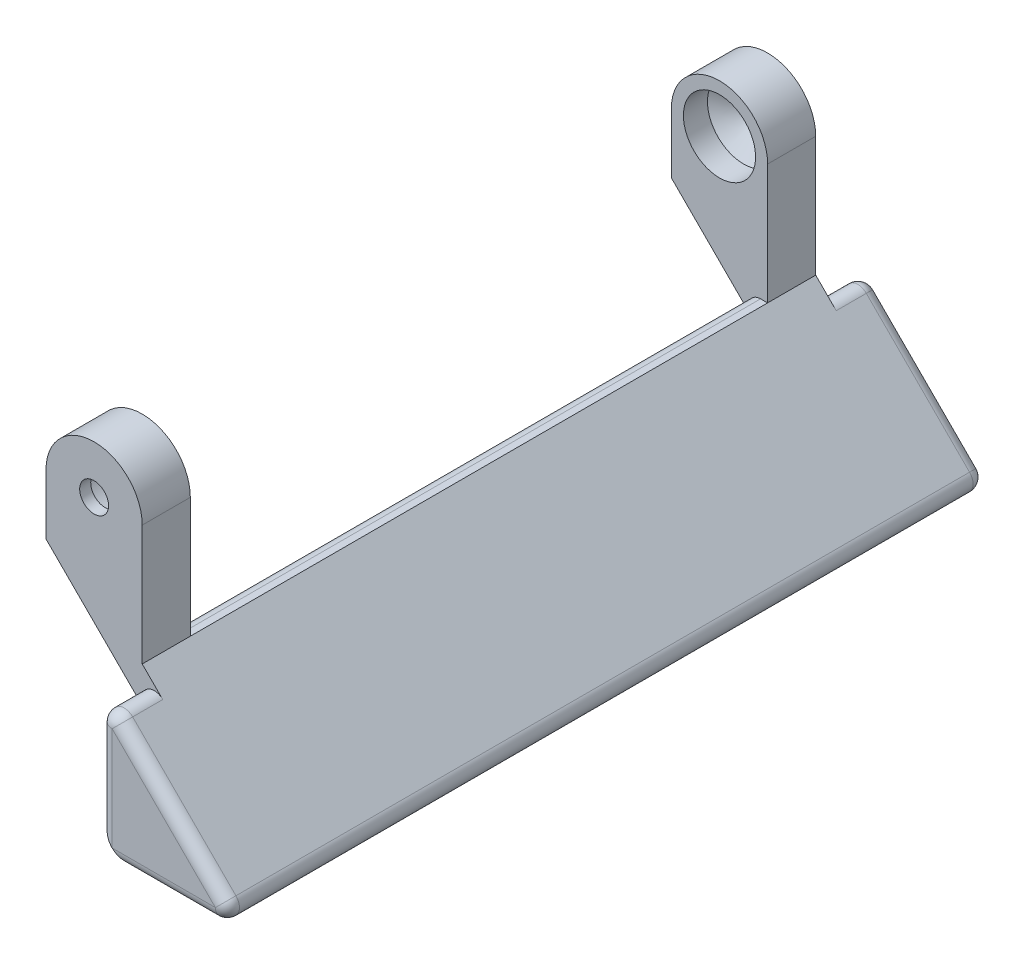
ISO-10303-21;
HEADER;
FILE_DESCRIPTION(('STEP AP214'),'2;1');
FILE_NAME('part.step','',(''),(''),'','','');
FILE_SCHEMA(('AUTOMOTIVE_DESIGN { 1 0 10303 214 1 1 1 1 }'));
ENDSEC;
DATA;
#1=APPLICATION_CONTEXT('core data for automotive mechanical design processes');
#2=APPLICATION_PROTOCOL_DEFINITION('international standard','automotive_design',2000,#1);
#3=PRODUCT_CONTEXT('',#1,'mechanical');
#4=PRODUCT('Part','Part','',(#3));
#5=PRODUCT_RELATED_PRODUCT_CATEGORY('part','',(#4));
#6=PRODUCT_DEFINITION_FORMATION('','',#4);
#7=PRODUCT_DEFINITION_CONTEXT('part definition',#1,'design');
#8=PRODUCT_DEFINITION('design','',#6,#7);
#9=PRODUCT_DEFINITION_SHAPE('','',#8);
#10=(LENGTH_UNIT() NAMED_UNIT(*) SI_UNIT(.MILLI.,.METRE.));
#11=(NAMED_UNIT(*) PLANE_ANGLE_UNIT() SI_UNIT($,.RADIAN.));
#12=(NAMED_UNIT(*) SI_UNIT($,.STERADIAN.) SOLID_ANGLE_UNIT());
#13=UNCERTAINTY_MEASURE_WITH_UNIT(LENGTH_MEASURE(1.E-05),#10,'distance_accuracy_value','');
#14=(GEOMETRIC_REPRESENTATION_CONTEXT(3) GLOBAL_UNCERTAINTY_ASSIGNED_CONTEXT((#13)) GLOBAL_UNIT_ASSIGNED_CONTEXT((#10,
#11,#12)) REPRESENTATION_CONTEXT('',''));
#15=CARTESIAN_POINT('',(0.,0.,0.));
#16=DIRECTION('',(0.,0.,1.));
#17=DIRECTION('',(1.,0.,0.));
#18=AXIS2_PLACEMENT_3D('',#15,#16,#17);
#19=CARTESIAN_POINT('',(0.,0.,63.));
#20=DIRECTION('',(1.,0.,0.));
#21=DIRECTION('',(0.,0.,-1.));
#22=AXIS2_PLACEMENT_3D('',#19,#20,#21);
#23=PLANE('',#22);
#24=DIRECTION('',(0.,1.,0.));
#25=VECTOR('',#24,1.);
#26=CARTESIAN_POINT('',(0.,0.,3.5));
#27=LINE('',#26,#25);
#28=CARTESIAN_POINT('',(0.,17.,3.5));
#29=VERTEX_POINT('',#28);
#30=CARTESIAN_POINT('',(0.,22.,3.5));
#31=VERTEX_POINT('',#30);
#32=EDGE_CURVE('E422',#29,#31,#27,.T.);
#33=ORIENTED_EDGE('',*,*,#32,.F.);
#34=DIRECTION('',(0.,0.,1.));
#35=VECTOR('',#34,1.);
#36=CARTESIAN_POINT('',(0.,17.,0.));
#37=LINE('',#36,#35);
#38=CARTESIAN_POINT('',(0.,17.,7.5));
#39=VERTEX_POINT('',#38);
#40=EDGE_CURVE('E219',#29,#39,#37,.T.);
#41=ORIENTED_EDGE('',*,*,#40,.T.);
#42=DIRECTION('',(0.,1.,0.));
#43=VECTOR('',#42,1.);
#44=CARTESIAN_POINT('',(0.,19.9999999999999,7.5));
#45=LINE('',#44,#43);
#46=CARTESIAN_POINT('',(0.,22.,7.5));
#47=VERTEX_POINT('',#46);
#48=EDGE_CURVE('E417',#39,#47,#45,.T.);
#49=ORIENTED_EDGE('',*,*,#48,.T.);
#50=DIRECTION('',(0.,0.,-1.));
#51=VECTOR('',#50,1.);
#52=CARTESIAN_POINT('',(0.,22.,63.));
#53=LINE('',#52,#51);
#54=EDGE_CURVE('E249',#47,#31,#53,.T.);
#55=ORIENTED_EDGE('',*,*,#54,.T.);
#56=EDGE_LOOP('',(#33,#41,#49,#55));
#57=FACE_BOUND('',#56,.T.);
#58=ADVANCED_FACE('F47',(#57),#23,.F.);
#59=CARTESIAN_POINT('',(4.,22.,63.));
#60=DIRECTION('',(0.,0.,-1.));
#61=DIRECTION('',(-1.,0.,0.));
#62=AXIS2_PLACEMENT_3D('',#59,#60,#61);
#63=CYLINDRICAL_SURFACE('',#62,4.);
#64=CARTESIAN_POINT('',(4.,22.,55.5));
#65=DIRECTION('',(0.,0.,-1.));
#66=DIRECTION('',(-1.,0.,0.));
#67=AXIS2_PLACEMENT_3D('',#64,#65,#66);
#68=CIRCLE('',#67,4.);
#69=CARTESIAN_POINT('',(8.,22.,55.5));
#70=VERTEX_POINT('',#69);
#71=CARTESIAN_POINT('',(0.,22.,55.5));
#72=VERTEX_POINT('',#71);
#73=EDGE_CURVE('E229',#70,#72,#68,.F.);
#74=ORIENTED_EDGE('',*,*,#73,.T.);
#75=CARTESIAN_POINT('',(0.,22.,59.5));
#76=VERTEX_POINT('',#75);
#77=EDGE_CURVE('E246',#76,#72,#53,.T.);
#78=ORIENTED_EDGE('',*,*,#77,.F.);
#79=CARTESIAN_POINT('',(4.,22.,59.5));
#80=DIRECTION('',(0.,0.,-1.));
#81=DIRECTION('',(-1.,0.,0.));
#82=AXIS2_PLACEMENT_3D('',#79,#80,#81);
#83=CIRCLE('',#82,4.);
#84=CARTESIAN_POINT('',(8.,22.,59.5));
#85=VERTEX_POINT('',#84);
#86=EDGE_CURVE('E223',#76,#85,#83,.T.);
#87=ORIENTED_EDGE('',*,*,#86,.T.);
#88=DIRECTION('',(0.,0.,-1.));
#89=VECTOR('',#88,1.);
#90=CARTESIAN_POINT('',(8.,22.,63.));
#91=LINE('',#90,#89);
#92=EDGE_CURVE('E239',#85,#70,#91,.T.);
#93=ORIENTED_EDGE('',*,*,#92,.T.);
#94=EDGE_LOOP('',(#74,#78,#87,#93));
#95=FACE_BOUND('',#94,.T.);
#96=ADVANCED_FACE('F407',(#95),#63,.T.);
#97=CARTESIAN_POINT('',(8.,11.9999999999999,63.));
#98=DIRECTION('',(-1.,0.,0.));
#99=DIRECTION('',(0.,0.,1.));
#100=AXIS2_PLACEMENT_3D('',#97,#98,#99);
#101=PLANE('',#100);
#102=DIRECTION('',(0.,1.,0.));
#103=VECTOR('',#102,1.);
#104=CARTESIAN_POINT('',(8.,22.,55.5));
#105=LINE('',#104,#103);
#106=CARTESIAN_POINT('',(8.,11.9999999999999,55.5));
#107=VERTEX_POINT('',#106);
#108=EDGE_CURVE('E225',#107,#70,#105,.T.);
#109=ORIENTED_EDGE('',*,*,#108,.T.);
#110=ORIENTED_EDGE('',*,*,#92,.F.);
#111=DIRECTION('',(0.,1.,0.));
#112=VECTOR('',#111,1.);
#113=CARTESIAN_POINT('',(8.,0.,59.5));
#114=LINE('',#113,#112);
#115=CARTESIAN_POINT('',(8.,11.9999999999999,59.5));
#116=VERTEX_POINT('',#115);
#117=EDGE_CURVE('E224',#116,#85,#114,.T.);
#118=ORIENTED_EDGE('',*,*,#117,.F.);
#119=DIRECTION('',(0.,0.,-1.));
#120=VECTOR('',#119,1.);
#121=CARTESIAN_POINT('',(8.,11.9999999999999,63.));
#122=LINE('',#121,#120);
#123=EDGE_CURVE('E245',#116,#107,#122,.T.);
#124=ORIENTED_EDGE('',*,*,#123,.T.);
#125=EDGE_LOOP('',(#109,#110,#118,#124));
#126=FACE_BOUND('',#125,.T.);
#127=ADVANCED_FACE('F403',(#126),#101,.F.);
#128=CARTESIAN_POINT('',(4.,22.,63.));
#129=DIRECTION('',(0.,0.,1.));
#130=DIRECTION('',(1.,0.,0.));
#131=AXIS2_PLACEMENT_3D('',#128,#129,#130);
#132=PLANE('',#131);
#133=DIRECTION('',(-0.707106781186551,0.707106781186544,0.));
#134=VECTOR('',#133,1.);
#135=CARTESIAN_POINT('',(7.29289321881345,11.2928932188133,63.));
#136=LINE('',#135,#134);
#137=CARTESIAN_POINT('',(17.5857864376269,1.,63.));
#138=VERTEX_POINT('',#137);
#139=CARTESIAN_POINT('',(9.,9.58578643762679,63.));
#140=VERTEX_POINT('',#139);
#141=EDGE_CURVE('E302',#138,#140,#136,.T.);
#142=ORIENTED_EDGE('',*,*,#141,.T.);
#143=DIRECTION('',(0.,1.,0.));
#144=VECTOR('',#143,1.);
#145=CARTESIAN_POINT('',(9.,2.00000000000001,63.));
#146=LINE('',#145,#144);
#147=CARTESIAN_POINT('',(9.00000000000001,0.999999999999997,63.));
#148=VERTEX_POINT('',#147);
#149=EDGE_CURVE('E340',#140,#148,#146,.F.);
#150=ORIENTED_EDGE('',*,*,#149,.T.);
#151=DIRECTION('',(1.,0.,0.));
#152=VECTOR('',#151,1.);
#153=CARTESIAN_POINT('',(20.,1.,63.));
#154=LINE('',#153,#152);
#155=EDGE_CURVE('E300',#148,#138,#154,.T.);
#156=ORIENTED_EDGE('',*,*,#155,.T.);
#157=EDGE_LOOP('',(#142,#150,#156));
#158=FACE_BOUND('',#157,.T.);
#159=ADVANCED_FACE('F385',(#158),#132,.T.);
#160=CARTESIAN_POINT('',(4.,22.,0.));
#161=DIRECTION('',(0.,0.,1.));
#162=DIRECTION('',(1.,0.,0.));
#163=AXIS2_PLACEMENT_3D('',#160,#161,#162);
#164=PLANE('',#163);
#165=DIRECTION('',(1.,0.,0.));
#166=VECTOR('',#165,1.);
#167=CARTESIAN_POINT('',(4.,1.,0.));
#168=LINE('',#167,#166);
#169=CARTESIAN_POINT('',(17.5857864376269,1.,0.));
#170=VERTEX_POINT('',#169);
#171=CARTESIAN_POINT('',(9.00000000000001,1.,0.));
#172=VERTEX_POINT('',#171);
#173=EDGE_CURVE('E290',#170,#172,#168,.F.);
#174=ORIENTED_EDGE('',*,*,#173,.T.);
#175=DIRECTION('',(0.,-1.,0.));
#176=VECTOR('',#175,1.);
#177=CARTESIAN_POINT('',(9.,22.,0.));
#178=LINE('',#177,#176);
#179=CARTESIAN_POINT('',(9.,9.58578643762679,0.));
#180=VERTEX_POINT('',#179);
#181=EDGE_CURVE('E336',#172,#180,#178,.F.);
#182=ORIENTED_EDGE('',*,*,#181,.T.);
#183=DIRECTION('',(-0.707106781186551,0.707106781186544,0.));
#184=VECTOR('',#183,1.);
#185=CARTESIAN_POINT('',(0.292893218813368,18.2928932188133,0.));
#186=LINE('',#185,#184);
#187=EDGE_CURVE('E293',#180,#170,#186,.F.);
#188=ORIENTED_EDGE('',*,*,#187,.T.);
#189=EDGE_LOOP('',(#174,#182,#188));
#190=FACE_BOUND('',#189,.T.);
#191=ADVANCED_FACE('F444',(#190),#164,.F.);
#192=ORIENTED_EDGE('',*,*,#54,.F.);
#193=CARTESIAN_POINT('',(4.,22.,7.5));
#194=DIRECTION('',(0.,0.,-1.));
#195=DIRECTION('',(0.,1.,0.));
#196=AXIS2_PLACEMENT_3D('',#193,#194,#195);
#197=CIRCLE('',#196,4.);
#198=CARTESIAN_POINT('',(8.,22.,7.5));
#199=VERTEX_POINT('',#198);
#200=EDGE_CURVE('E410',#47,#199,#197,.T.);
#201=ORIENTED_EDGE('',*,*,#200,.T.);
#202=CARTESIAN_POINT('',(8.,22.,3.5));
#203=VERTEX_POINT('',#202);
#204=EDGE_CURVE('E238',#199,#203,#91,.T.);
#205=ORIENTED_EDGE('',*,*,#204,.T.);
#206=CARTESIAN_POINT('',(4.,22.,3.5));
#207=DIRECTION('',(0.,0.,1.));
#208=DIRECTION('',(1.,0.,0.));
#209=AXIS2_PLACEMENT_3D('',#206,#207,#208);
#210=CIRCLE('',#209,4.);
#211=EDGE_CURVE('E234',#203,#31,#210,.T.);
#212=ORIENTED_EDGE('',*,*,#211,.T.);
#213=EDGE_LOOP('',(#192,#201,#205,#212));
#214=FACE_BOUND('',#213,.T.);
#215=ADVANCED_FACE('F471',(#214),#63,.T.);
#216=DIRECTION('',(0.,-1.,0.));
#217=VECTOR('',#216,1.);
#218=CARTESIAN_POINT('',(0.,19.9999999999999,55.5));
#219=LINE('',#218,#217);
#220=CARTESIAN_POINT('',(0.,17.,55.5));
#221=VERTEX_POINT('',#220);
#222=EDGE_CURVE('E218',#72,#221,#219,.T.);
#223=ORIENTED_EDGE('',*,*,#222,.T.);
#224=CARTESIAN_POINT('',(0.,17.,59.5));
#225=VERTEX_POINT('',#224);
#226=EDGE_CURVE('E201',#221,#225,#37,.T.);
#227=ORIENTED_EDGE('',*,*,#226,.T.);
#228=DIRECTION('',(0.,-1.,0.));
#229=VECTOR('',#228,1.);
#230=CARTESIAN_POINT('',(0.,0.,59.5));
#231=LINE('',#230,#229);
#232=EDGE_CURVE('E216',#76,#225,#231,.T.);
#233=ORIENTED_EDGE('',*,*,#232,.F.);
#234=ORIENTED_EDGE('',*,*,#77,.T.);
#235=EDGE_LOOP('',(#223,#227,#233,#234));
#236=FACE_BOUND('',#235,.T.);
#237=ADVANCED_FACE('F214',(#236),#23,.F.);
#238=CARTESIAN_POINT('',(0.,0.,63.));
#239=DIRECTION('',(0.,1.,0.));
#240=DIRECTION('',(0.,0.,1.));
#241=AXIS2_PLACEMENT_3D('',#238,#239,#240);
#242=PLANE('',#241);
#243=DIRECTION('',(0.,0.,-1.));
#244=VECTOR('',#243,1.);
#245=CARTESIAN_POINT('',(10.,0.,63.));
#246=LINE('',#245,#244);
#247=CARTESIAN_POINT('',(10.,0.,62.));
#248=VERTEX_POINT('',#247);
#249=CARTESIAN_POINT('',(10.,0.,1.));
#250=VERTEX_POINT('',#249);
#251=EDGE_CURVE('E252',#248,#250,#246,.T.);
#252=ORIENTED_EDGE('',*,*,#251,.T.);
#253=DIRECTION('',(1.,0.,0.));
#254=VECTOR('',#253,1.);
#255=CARTESIAN_POINT('',(0.,0.,1.));
#256=LINE('',#255,#254);
#257=CARTESIAN_POINT('',(17.5857864376269,0.,1.));
#258=VERTEX_POINT('',#257);
#259=EDGE_CURVE('E288',#250,#258,#256,.T.);
#260=ORIENTED_EDGE('',*,*,#259,.T.);
#261=DIRECTION('',(0.,0.,-1.));
#262=VECTOR('',#261,1.);
#263=CARTESIAN_POINT('',(17.5857864376269,0.,63.));
#264=LINE('',#263,#262);
#265=CARTESIAN_POINT('',(17.5857864376269,0.,62.));
#266=VERTEX_POINT('',#265);
#267=EDGE_CURVE('E286',#258,#266,#264,.F.);
#268=ORIENTED_EDGE('',*,*,#267,.T.);
#269=DIRECTION('',(1.,0.,0.));
#270=VECTOR('',#269,1.);
#271=CARTESIAN_POINT('',(10.,0.,62.));
#272=LINE('',#271,#270);
#273=EDGE_CURVE('E284',#266,#248,#272,.F.);
#274=ORIENTED_EDGE('',*,*,#273,.T.);
#275=EDGE_LOOP('',(#252,#260,#268,#274));
#276=FACE_BOUND('',#275,.T.);
#277=ADVANCED_FACE('F453',(#276),#242,.F.);
#278=CARTESIAN_POINT('',(20.,0.,63.));
#279=DIRECTION('',(-0.707106781186544,-0.707106781186552,0.));
#280=DIRECTION('',(0.707106781186551,-0.707106781186544,0.));
#281=AXIS2_PLACEMENT_3D('',#278,#279,#280);
#282=PLANE('',#281);
#283=DIRECTION('',(-0.707106781186551,0.707106781186544,0.));
#284=VECTOR('',#283,1.);
#285=CARTESIAN_POINT('',(20.,0.,1.));
#286=LINE('',#285,#284);
#287=CARTESIAN_POINT('',(18.2928932188134,1.70710678118655,1.));
#288=VERTEX_POINT('',#287);
#289=CARTESIAN_POINT('',(9.70710678118655,10.2928932188133,1.));
#290=VERTEX_POINT('',#289);
#291=EDGE_CURVE('E281',#288,#290,#286,.T.);
#292=ORIENTED_EDGE('',*,*,#291,.T.);
#293=DIRECTION('',(0.,0.,-1.));
#294=VECTOR('',#293,1.);
#295=CARTESIAN_POINT('',(9.70710678118655,10.2928932188133,63.));
#296=LINE('',#295,#294);
#297=CARTESIAN_POINT('',(9.70710678118655,10.2928932188133,3.5));
#298=VERTEX_POINT('',#297);
#299=EDGE_CURVE('E348',#290,#298,#296,.F.);
#300=ORIENTED_EDGE('',*,*,#299,.T.);
#301=DIRECTION('',(-0.707106781186551,0.707106781186544,0.));
#302=VECTOR('',#301,1.);
#303=CARTESIAN_POINT('',(20.,0.,3.5));
#304=LINE('',#303,#302);
#305=CARTESIAN_POINT('',(8.,11.9999999999999,3.5));
#306=VERTEX_POINT('',#305);
#307=EDGE_CURVE('E71',#298,#306,#304,.T.);
#308=ORIENTED_EDGE('',*,*,#307,.T.);
#309=CARTESIAN_POINT('',(8.,12.,7.49999999999999));
#310=VERTEX_POINT('',#309);
#311=EDGE_CURVE('E242',#310,#306,#122,.T.);
#312=ORIENTED_EDGE('',*,*,#311,.F.);
#313=DIRECTION('',(0.,0.,1.));
#314=VECTOR('',#313,1.);
#315=CARTESIAN_POINT('',(7.99999999999987,12.,63.));
#316=LINE('',#315,#314);
#317=EDGE_CURVE('E399',#310,#107,#316,.T.);
#318=ORIENTED_EDGE('',*,*,#317,.T.);
#319=ORIENTED_EDGE('',*,*,#123,.F.);
#320=DIRECTION('',(0.707106781186551,-0.707106781186544,0.));
#321=VECTOR('',#320,1.);
#322=CARTESIAN_POINT('',(20.,0.,59.5));
#323=LINE('',#322,#321);
#324=CARTESIAN_POINT('',(9.70710678118655,10.2928932188133,59.5));
#325=VERTEX_POINT('',#324);
#326=EDGE_CURVE('E63',#116,#325,#323,.T.);
#327=ORIENTED_EDGE('',*,*,#326,.T.);
#328=DIRECTION('',(0.,0.,-1.));
#329=VECTOR('',#328,1.);
#330=CARTESIAN_POINT('',(9.70710678118655,10.2928932188133,63.));
#331=LINE('',#330,#329);
#332=CARTESIAN_POINT('',(9.70710678118655,10.2928932188133,62.));
#333=VERTEX_POINT('',#332);
#334=EDGE_CURVE('E344',#325,#333,#331,.F.);
#335=ORIENTED_EDGE('',*,*,#334,.T.);
#336=DIRECTION('',(-0.707106781186551,0.707106781186544,0.));
#337=VECTOR('',#336,1.);
#338=CARTESIAN_POINT('',(20.,0.,62.));
#339=LINE('',#338,#337);
#340=CARTESIAN_POINT('',(18.2928932188134,1.70710678118655,62.));
#341=VERTEX_POINT('',#340);
#342=EDGE_CURVE('E276',#333,#341,#339,.F.);
#343=ORIENTED_EDGE('',*,*,#342,.T.);
#344=DIRECTION('',(0.,0.,-1.));
#345=VECTOR('',#344,1.);
#346=CARTESIAN_POINT('',(18.2928932188134,1.70710678118655,63.));
#347=LINE('',#346,#345);
#348=EDGE_CURVE('E278',#341,#288,#347,.T.);
#349=ORIENTED_EDGE('',*,*,#348,.T.);
#350=EDGE_LOOP('',(#292,#300,#308,#312,#318,#319,#327,#335,#343,#349));
#351=FACE_BOUND('',#350,.T.);
#352=ADVANCED_FACE('F392',(#351),#282,.F.);
#353=ORIENTED_EDGE('',*,*,#204,.F.);
#354=DIRECTION('',(0.,-1.,0.));
#355=VECTOR('',#354,1.);
#356=CARTESIAN_POINT('',(8.,22.,7.5));
#357=LINE('',#356,#355);
#358=EDGE_CURVE('E414',#199,#310,#357,.T.);
#359=ORIENTED_EDGE('',*,*,#358,.T.);
#360=ORIENTED_EDGE('',*,*,#311,.T.);
#361=DIRECTION('',(0.,-1.,0.));
#362=VECTOR('',#361,1.);
#363=CARTESIAN_POINT('',(8.,0.,3.5));
#364=LINE('',#363,#362);
#365=EDGE_CURVE('E235',#203,#306,#364,.T.);
#366=ORIENTED_EDGE('',*,*,#365,.F.);
#367=EDGE_LOOP('',(#353,#359,#360,#366));
#368=FACE_BOUND('',#367,.T.);
#369=ADVANCED_FACE('F467',(#368),#101,.F.);
#370=CARTESIAN_POINT('',(8.,0.,0.));
#371=DIRECTION('',(1.,0.,0.));
#372=DIRECTION('',(0.,0.,-1.));
#373=AXIS2_PLACEMENT_3D('',#370,#371,#372);
#374=PLANE('',#373);
#375=DIRECTION('',(0.,0.,-1.));
#376=VECTOR('',#375,1.);
#377=CARTESIAN_POINT('',(8.,9.58578643762679,0.));
#378=LINE('',#377,#376);
#379=CARTESIAN_POINT('',(8.,9.58578643762679,3.5));
#380=VERTEX_POINT('',#379);
#381=CARTESIAN_POINT('',(8.,9.58578643762679,1.));
#382=VERTEX_POINT('',#381);
#383=EDGE_CURVE('E327',#380,#382,#378,.T.);
#384=ORIENTED_EDGE('',*,*,#383,.T.);
#385=DIRECTION('',(0.,-1.,0.));
#386=VECTOR('',#385,1.);
#387=CARTESIAN_POINT('',(8.,0.,1.));
#388=LINE('',#387,#386);
#389=CARTESIAN_POINT('',(8.,2.00000000000001,1.));
#390=VERTEX_POINT('',#389);
#391=EDGE_CURVE('E329',#382,#390,#388,.T.);
#392=ORIENTED_EDGE('',*,*,#391,.T.);
#393=DIRECTION('',(0.,0.,1.));
#394=VECTOR('',#393,1.);
#395=CARTESIAN_POINT('',(8.,2.00000000000001,0.));
#396=LINE('',#395,#394);
#397=CARTESIAN_POINT('',(8.,2.00000000000001,62.));
#398=VERTEX_POINT('',#397);
#399=EDGE_CURVE('E248',#390,#398,#396,.T.);
#400=ORIENTED_EDGE('',*,*,#399,.T.);
#401=DIRECTION('',(0.,1.,0.));
#402=VECTOR('',#401,1.);
#403=CARTESIAN_POINT('',(8.,10.5857864376268,62.));
#404=LINE('',#403,#402);
#405=CARTESIAN_POINT('',(8.,9.58578643762679,62.));
#406=VERTEX_POINT('',#405);
#407=EDGE_CURVE('E324',#398,#406,#404,.T.);
#408=ORIENTED_EDGE('',*,*,#407,.T.);
#409=DIRECTION('',(0.,0.,-1.));
#410=VECTOR('',#409,1.);
#411=CARTESIAN_POINT('',(8.,9.58578643762679,0.));
#412=LINE('',#411,#410);
#413=CARTESIAN_POINT('',(8.,9.58578643762679,59.5));
#414=VERTEX_POINT('',#413);
#415=EDGE_CURVE('E305',#406,#414,#412,.T.);
#416=ORIENTED_EDGE('',*,*,#415,.T.);
#417=CARTESIAN_POINT('',(8.,8.99999999999998,59.5));
#418=VERTEX_POINT('',#417);
#419=EDGE_CURVE('E227',#418,#414,#114,.T.);
#420=ORIENTED_EDGE('',*,*,#419,.F.);
#421=DIRECTION('',(0.,0.,-1.));
#422=VECTOR('',#421,1.);
#423=CARTESIAN_POINT('',(8.,8.99999999999998,3.5));
#424=LINE('',#423,#422);
#425=CARTESIAN_POINT('',(8.,8.99999999999998,3.5));
#426=VERTEX_POINT('',#425);
#427=EDGE_CURVE('E205',#418,#426,#424,.T.);
#428=ORIENTED_EDGE('',*,*,#427,.T.);
#429=EDGE_CURVE('E421',#380,#426,#364,.T.);
#430=ORIENTED_EDGE('',*,*,#429,.F.);
#431=EDGE_LOOP('',(#384,#392,#400,#408,#416,#420,#428,#430));
#432=FACE_BOUND('',#431,.T.);
#433=ADVANCED_FACE('F370',(#432),#374,.F.);
#434=CARTESIAN_POINT('',(34.2345192446898,0.,59.5));
#435=DIRECTION('',(0.,0.,-1.));
#436=DIRECTION('',(-1.,0.,0.));
#437=AXIS2_PLACEMENT_3D('',#434,#435,#436);
#438=PLANE('',#437);
#439=CARTESIAN_POINT('',(4.,22.,59.5));
#440=DIRECTION('',(0.,0.,-1.));
#441=DIRECTION('',(-1.,0.,0.));
#442=AXIS2_PLACEMENT_3D('',#439,#440,#441);
#443=CIRCLE('',#442,1.2);
#444=CARTESIAN_POINT('',(2.8,22.,59.5));
#445=VERTEX_POINT('',#444);
#446=EDGE_CURVE('E261',#445,#445,#443,.T.);
#447=ORIENTED_EDGE('',*,*,#446,.T.);
#448=EDGE_LOOP('',(#447));
#449=FACE_BOUND('',#448,.T.);
#450=ORIENTED_EDGE('',*,*,#232,.T.);
#451=DIRECTION('',(-0.707106781186544,0.707106781186551,0.));
#452=VECTOR('',#451,1.);
#453=CARTESIAN_POINT('',(25.6172596223448,-8.61725962234496,59.5));
#454=LINE('',#453,#452);
#455=EDGE_CURVE('E198',#225,#418,#454,.F.);
#456=ORIENTED_EDGE('',*,*,#455,.T.);
#457=ORIENTED_EDGE('',*,*,#419,.T.);
#458=CARTESIAN_POINT('',(9.,9.58578643762679,59.5));
#459=DIRECTION('',(0.,0.,-1.));
#460=DIRECTION('',(-1.,0.,0.));
#461=AXIS2_PLACEMENT_3D('',#458,#459,#460);
#462=CIRCLE('',#461,1.);
#463=EDGE_CURVE('E13',#414,#325,#462,.T.);
#464=ORIENTED_EDGE('',*,*,#463,.T.);
#465=ORIENTED_EDGE('',*,*,#326,.F.);
#466=ORIENTED_EDGE('',*,*,#117,.T.);
#467=ORIENTED_EDGE('',*,*,#86,.F.);
#468=EDGE_LOOP('',(#450,#456,#457,#464,#465,#466,#467));
#469=FACE_BOUND('',#468,.T.);
#470=ADVANCED_FACE('F222',(#449,#469),#438,.F.);
#471=CARTESIAN_POINT('',(34.2345192446898,0.,3.5));
#472=DIRECTION('',(0.,0.,1.));
#473=DIRECTION('',(1.,0.,0.));
#474=AXIS2_PLACEMENT_3D('',#471,#472,#473);
#475=PLANE('',#474);
#476=CARTESIAN_POINT('',(4.,22.,3.5));
#477=DIRECTION('',(0.,0.,1.));
#478=DIRECTION('',(1.,0.,0.));
#479=AXIS2_PLACEMENT_3D('',#476,#477,#478);
#480=CIRCLE('',#479,1.2);
#481=CARTESIAN_POINT('',(5.2,22.,3.5));
#482=VERTEX_POINT('',#481);
#483=EDGE_CURVE('E260',#482,#482,#480,.T.);
#484=ORIENTED_EDGE('',*,*,#483,.T.);
#485=EDGE_LOOP('',(#484));
#486=FACE_BOUND('',#485,.T.);
#487=DIRECTION('',(0.707106781186544,-0.707106781186551,0.));
#488=VECTOR('',#487,1.);
#489=CARTESIAN_POINT('',(25.6172596223448,-8.61725962234496,3.5));
#490=LINE('',#489,#488);
#491=EDGE_CURVE('E209',#426,#29,#490,.F.);
#492=ORIENTED_EDGE('',*,*,#491,.T.);
#493=ORIENTED_EDGE('',*,*,#32,.T.);
#494=ORIENTED_EDGE('',*,*,#211,.F.);
#495=ORIENTED_EDGE('',*,*,#365,.T.);
#496=ORIENTED_EDGE('',*,*,#307,.F.);
#497=CARTESIAN_POINT('',(9.,9.58578643762679,3.5));
#498=DIRECTION('',(0.,0.,1.));
#499=DIRECTION('',(1.,0.,0.));
#500=AXIS2_PLACEMENT_3D('',#497,#498,#499);
#501=CIRCLE('',#500,1.);
#502=EDGE_CURVE('E56',#298,#380,#501,.T.);
#503=ORIENTED_EDGE('',*,*,#502,.T.);
#504=ORIENTED_EDGE('',*,*,#429,.T.);
#505=EDGE_LOOP('',(#492,#493,#494,#495,#496,#503,#504));
#506=FACE_BOUND('',#505,.T.);
#507=ADVANCED_FACE('F468',(#486,#506),#475,.F.);
#508=CARTESIAN_POINT('',(8.,2.00000000000001,0.));
#509=DIRECTION('',(0.707106781186546,0.707106781186549,0.));
#510=DIRECTION('',(0.,0.,1.));
#511=AXIS2_PLACEMENT_3D('',#508,#509,#510);
#512=PLANE('',#511);
#513=ORIENTED_EDGE('',*,*,#399,.F.);
#514=CARTESIAN_POINT('',(9.,1.00000000000001,1.));
#515=DIRECTION('',(0.707106781186546,0.707106781186549,0.));
#516=DIRECTION('',(0.707106781186549,-0.707106781186546,0.));
#517=AXIS2_PLACEMENT_3D('',#514,#515,#516);
#518=ELLIPSE('',#517,1.41421356237309,1.);
#519=EDGE_CURVE('E334',#390,#172,#518,.F.);
#520=ORIENTED_EDGE('',*,*,#519,.T.);
#521=CARTESIAN_POINT('',(9.00000000000001,1.,1.));
#522=DIRECTION('',(0.707106781186546,0.707106781186549,0.));
#523=DIRECTION('',(0.707106781186549,-0.707106781186546,0.));
#524=AXIS2_PLACEMENT_3D('',#521,#522,#523);
#525=ELLIPSE('',#524,1.4142135623731,1.);
#526=EDGE_CURVE('E298',#172,#250,#525,.F.);
#527=ORIENTED_EDGE('',*,*,#526,.T.);
#528=ORIENTED_EDGE('',*,*,#251,.F.);
#529=CARTESIAN_POINT('',(9.00000000000001,1.,62.));
#530=DIRECTION('',(0.707106781186546,0.707106781186549,0.));
#531=DIRECTION('',(-0.707106781186549,0.707106781186546,0.));
#532=AXIS2_PLACEMENT_3D('',#529,#530,#531);
#533=ELLIPSE('',#532,1.4142135623731,1.);
#534=EDGE_CURVE('E295',#248,#148,#533,.F.);
#535=ORIENTED_EDGE('',*,*,#534,.T.);
#536=CARTESIAN_POINT('',(9.,1.00000000000001,62.));
#537=DIRECTION('',(0.707106781186546,0.707106781186549,0.));
#538=DIRECTION('',(0.707106781186549,-0.707106781186546,0.));
#539=AXIS2_PLACEMENT_3D('',#536,#537,#538);
#540=ELLIPSE('',#539,1.41421356237309,1.);
#541=EDGE_CURVE('E332',#148,#398,#540,.F.);
#542=ORIENTED_EDGE('',*,*,#541,.T.);
#543=EDGE_LOOP('',(#513,#520,#527,#528,#535,#542));
#544=FACE_BOUND('',#543,.T.);
#545=ADVANCED_FACE('F375',(#544),#512,.F.);
#546=CARTESIAN_POINT('',(8.,8.99999999999998,0.));
#547=DIRECTION('',(-0.707106781186551,-0.707106781186544,0.));
#548=DIRECTION('',(0.,0.,1.));
#549=AXIS2_PLACEMENT_3D('',#546,#547,#548);
#550=PLANE('',#549);
#551=DIRECTION('',(0.707106781186547,-0.707106781186548,0.));
#552=VECTOR('',#551,1.);
#553=CARTESIAN_POINT('',(25.6172596223449,-8.6172596223449,55.5));
#554=LINE('',#553,#552);
#555=CARTESIAN_POINT('',(6.70710678118654,10.2928932188135,55.5));
#556=VERTEX_POINT('',#555);
#557=EDGE_CURVE('E502',#221,#556,#554,.T.);
#558=ORIENTED_EDGE('',*,*,#557,.T.);
#559=DIRECTION('',(0.,0.,1.));
#560=VECTOR('',#559,1.);
#561=CARTESIAN_POINT('',(6.70710678118654,10.2928932188135,0.));
#562=LINE('',#561,#560);
#563=CARTESIAN_POINT('',(6.70710678118656,10.2928932188135,7.5));
#564=VERTEX_POINT('',#563);
#565=EDGE_CURVE('E268',#556,#564,#562,.F.);
#566=ORIENTED_EDGE('',*,*,#565,.T.);
#567=DIRECTION('',(0.707106781186547,-0.707106781186548,0.));
#568=VECTOR('',#567,1.);
#569=CARTESIAN_POINT('',(-0.499999999999988,17.5,7.5));
#570=LINE('',#569,#568);
#571=EDGE_CURVE('E265',#39,#564,#570,.T.);
#572=ORIENTED_EDGE('',*,*,#571,.F.);
#573=ORIENTED_EDGE('',*,*,#40,.F.);
#574=ORIENTED_EDGE('',*,*,#491,.F.);
#575=ORIENTED_EDGE('',*,*,#427,.F.);
#576=ORIENTED_EDGE('',*,*,#455,.F.);
#577=ORIENTED_EDGE('',*,*,#226,.F.);
#578=EDGE_LOOP('',(#558,#566,#572,#573,#574,#575,#576,#577));
#579=FACE_BOUND('',#578,.T.);
#580=ADVANCED_FACE('F200',(#579),#550,.T.);
#581=CARTESIAN_POINT('',(4.,22.,7.5));
#582=DIRECTION('',(0.,0.,-1.));
#583=DIRECTION('',(0.,1.,0.));
#584=AXIS2_PLACEMENT_3D('',#581,#582,#583);
#585=PLANE('',#584);
#586=CARTESIAN_POINT('',(4.,22.,7.50000000000001));
#587=DIRECTION('',(0.,0.,1.));
#588=DIRECTION('',(0.,-1.,0.));
#589=AXIS2_PLACEMENT_3D('',#586,#587,#588);
#590=CIRCLE('',#589,2.99999999999999);
#591=CARTESIAN_POINT('',(4.,19.,7.50000000000001));
#592=VERTEX_POINT('',#591);
#593=EDGE_CURVE('E488',#592,#592,#590,.T.);
#594=ORIENTED_EDGE('',*,*,#593,.F.);
#595=EDGE_LOOP('',(#594));
#596=FACE_BOUND('',#595,.T.);
#597=ORIENTED_EDGE('',*,*,#48,.F.);
#598=ORIENTED_EDGE('',*,*,#571,.T.);
#599=CARTESIAN_POINT('',(7.41421356237309,11.,7.5));
#600=DIRECTION('',(0.,0.,-1.));
#601=DIRECTION('',(0.,1.,0.));
#602=AXIS2_PLACEMENT_3D('',#599,#600,#601);
#603=CIRCLE('',#602,1.);
#604=CARTESIAN_POINT('',(7.41421356237309,12.,7.49999999999999));
#605=VERTEX_POINT('',#604);
#606=EDGE_CURVE('E274',#564,#605,#603,.T.);
#607=ORIENTED_EDGE('',*,*,#606,.T.);
#608=DIRECTION('',(1.,0.,0.));
#609=VECTOR('',#608,1.);
#610=CARTESIAN_POINT('',(0.,12.,7.49999999999999));
#611=LINE('',#610,#609);
#612=EDGE_CURVE('E477',#605,#310,#611,.T.);
#613=ORIENTED_EDGE('',*,*,#612,.T.);
#614=ORIENTED_EDGE('',*,*,#358,.F.);
#615=ORIENTED_EDGE('',*,*,#200,.F.);
#616=EDGE_LOOP('',(#597,#598,#607,#613,#614,#615));
#617=FACE_BOUND('',#616,.T.);
#618=ADVANCED_FACE('F475',(#596,#617),#585,.F.);
#619=CARTESIAN_POINT('',(34.2345192446898,0.,55.5));
#620=DIRECTION('',(0.,0.,-1.));
#621=DIRECTION('',(-1.,0.,0.));
#622=AXIS2_PLACEMENT_3D('',#619,#620,#621);
#623=PLANE('',#622);
#624=ORIENTED_EDGE('',*,*,#557,.F.);
#625=ORIENTED_EDGE('',*,*,#222,.F.);
#626=ORIENTED_EDGE('',*,*,#73,.F.);
#627=ORIENTED_EDGE('',*,*,#108,.F.);
#628=DIRECTION('',(1.,0.,0.));
#629=VECTOR('',#628,1.);
#630=CARTESIAN_POINT('',(0.,12.,55.5));
#631=LINE('',#630,#629);
#632=CARTESIAN_POINT('',(7.41421356237309,12.,55.5));
#633=VERTEX_POINT('',#632);
#634=EDGE_CURVE('E481',#633,#107,#631,.T.);
#635=ORIENTED_EDGE('',*,*,#634,.F.);
#636=CARTESIAN_POINT('',(7.41421356237309,11.,55.5));
#637=DIRECTION('',(0.,0.,-1.));
#638=DIRECTION('',(-1.,0.,0.));
#639=AXIS2_PLACEMENT_3D('',#636,#637,#638);
#640=CIRCLE('',#639,1.);
#641=EDGE_CURVE('E271',#633,#556,#640,.F.);
#642=ORIENTED_EDGE('',*,*,#641,.T.);
#643=EDGE_LOOP('',(#624,#625,#626,#627,#635,#642));
#644=FACE_BOUND('',#643,.T.);
#645=CARTESIAN_POINT('',(4.,22.,55.5));
#646=DIRECTION('',(0.,0.,-1.));
#647=DIRECTION('',(-1.,0.,0.));
#648=AXIS2_PLACEMENT_3D('',#645,#646,#647);
#649=CIRCLE('',#648,2.99999999999999);
#650=CARTESIAN_POINT('',(1.00000000000001,22.,55.5));
#651=VERTEX_POINT('',#650);
#652=EDGE_CURVE('E494',#651,#651,#649,.T.);
#653=ORIENTED_EDGE('',*,*,#652,.F.);
#654=EDGE_LOOP('',(#653));
#655=FACE_BOUND('',#654,.T.);
#656=ADVANCED_FACE('F511',(#644,#655),#623,.T.);
#657=CARTESIAN_POINT('',(0.,12.,55.5));
#658=DIRECTION('',(0.,-1.,0.));
#659=DIRECTION('',(0.,0.,-1.));
#660=AXIS2_PLACEMENT_3D('',#657,#658,#659);
#661=PLANE('',#660);
#662=ORIENTED_EDGE('',*,*,#612,.F.);
#663=DIRECTION('',(0.,0.,-1.));
#664=VECTOR('',#663,1.);
#665=CARTESIAN_POINT('',(7.41421356237309,12.,55.5));
#666=LINE('',#665,#664);
#667=EDGE_CURVE('E208',#605,#633,#666,.F.);
#668=ORIENTED_EDGE('',*,*,#667,.T.);
#669=ORIENTED_EDGE('',*,*,#634,.T.);
#670=ORIENTED_EDGE('',*,*,#317,.F.);
#671=EDGE_LOOP('',(#662,#668,#669,#670));
#672=FACE_BOUND('',#671,.T.);
#673=ADVANCED_FACE('F510',(#672),#661,.F.);
#674=CARTESIAN_POINT('',(4.,22.,5.5));
#675=DIRECTION('',(0.,0.,1.));
#676=DIRECTION('',(0.,-1.,0.));
#677=AXIS2_PLACEMENT_3D('',#674,#675,#676);
#678=CONICAL_SURFACE('',#677,3.,1.02974425867665);
#679=CARTESIAN_POINT('',(4.,22.,4.41845088575039));
#680=DIRECTION('',(0.,0.,1.));
#681=DIRECTION('',(0.,-1.,0.));
#682=AXIS2_PLACEMENT_3D('',#679,#680,#681);
#683=CIRCLE('',#682,1.2);
#684=CARTESIAN_POINT('',(4.,20.8,4.41845088575039));
#685=VERTEX_POINT('',#684);
#686=EDGE_CURVE('E257',#685,#685,#683,.F.);
#687=ORIENTED_EDGE('',*,*,#686,.T.);
#688=EDGE_LOOP('',(#687));
#689=FACE_BOUND('',#688,.T.);
#690=CARTESIAN_POINT('',(4.,22.,5.5));
#691=DIRECTION('',(0.,0.,1.));
#692=DIRECTION('',(0.,-1.,0.));
#693=AXIS2_PLACEMENT_3D('',#690,#691,#692);
#694=CIRCLE('',#693,3.);
#695=CARTESIAN_POINT('',(4.,19.,5.50000000000001));
#696=VERTEX_POINT('',#695);
#697=EDGE_CURVE('E483',#696,#696,#694,.T.);
#698=ORIENTED_EDGE('',*,*,#697,.T.);
#699=EDGE_LOOP('',(#698));
#700=FACE_BOUND('',#699,.T.);
#701=ADVANCED_FACE('F665',(#689,#700),#678,.F.);
#702=CARTESIAN_POINT('',(4.,22.,7.5));
#703=DIRECTION('',(0.,0.,1.));
#704=DIRECTION('',(0.,-1.,0.));
#705=AXIS2_PLACEMENT_3D('',#702,#703,#704);
#706=CYLINDRICAL_SURFACE('',#705,2.99999999999999);
#707=ORIENTED_EDGE('',*,*,#697,.F.);
#708=EDGE_LOOP('',(#707));
#709=FACE_BOUND('',#708,.T.);
#710=ORIENTED_EDGE('',*,*,#593,.T.);
#711=EDGE_LOOP('',(#710));
#712=FACE_BOUND('',#711,.T.);
#713=ADVANCED_FACE('F530',(#709,#712),#706,.F.);
#714=CARTESIAN_POINT('',(4.,22.,57.5));
#715=DIRECTION('',(0.,0.,-1.));
#716=DIRECTION('',(-1.,0.,0.));
#717=AXIS2_PLACEMENT_3D('',#714,#715,#716);
#718=CONICAL_SURFACE('',#717,2.99999999999999,1.02974425867665);
#719=CARTESIAN_POINT('',(4.,22.,58.5815491142496));
#720=DIRECTION('',(0.,0.,-1.));
#721=DIRECTION('',(-1.,0.,0.));
#722=AXIS2_PLACEMENT_3D('',#719,#720,#721);
#723=CIRCLE('',#722,1.2);
#724=CARTESIAN_POINT('',(2.8,22.,58.5815491142496));
#725=VERTEX_POINT('',#724);
#726=EDGE_CURVE('E262',#725,#725,#723,.F.);
#727=ORIENTED_EDGE('',*,*,#726,.T.);
#728=EDGE_LOOP('',(#727));
#729=FACE_BOUND('',#728,.T.);
#730=CARTESIAN_POINT('',(4.,22.,57.5));
#731=DIRECTION('',(0.,0.,-1.));
#732=DIRECTION('',(-1.,0.,0.));
#733=AXIS2_PLACEMENT_3D('',#730,#731,#732);
#734=CIRCLE('',#733,2.99999999999999);
#735=CARTESIAN_POINT('',(1.00000000000001,22.,57.5));
#736=VERTEX_POINT('',#735);
#737=EDGE_CURVE('E491',#736,#736,#734,.T.);
#738=ORIENTED_EDGE('',*,*,#737,.T.);
#739=EDGE_LOOP('',(#738));
#740=FACE_BOUND('',#739,.T.);
#741=ADVANCED_FACE('F520',(#729,#740),#718,.F.);
#742=CARTESIAN_POINT('',(4.,22.,55.5));
#743=DIRECTION('',(0.,0.,-1.));
#744=DIRECTION('',(-1.,0.,0.));
#745=AXIS2_PLACEMENT_3D('',#742,#743,#744);
#746=CYLINDRICAL_SURFACE('',#745,2.99999999999999);
#747=ORIENTED_EDGE('',*,*,#737,.F.);
#748=EDGE_LOOP('',(#747));
#749=FACE_BOUND('',#748,.T.);
#750=ORIENTED_EDGE('',*,*,#652,.T.);
#751=EDGE_LOOP('',(#750));
#752=FACE_BOUND('',#751,.T.);
#753=ADVANCED_FACE('F517',(#749,#752),#746,.F.);
#754=CARTESIAN_POINT('',(4.,22.,7.5));
#755=DIRECTION('',(0.,0.,1.));
#756=DIRECTION('',(0.,-1.,0.));
#757=AXIS2_PLACEMENT_3D('',#754,#755,#756);
#758=CYLINDRICAL_SURFACE('',#757,1.2);
#759=ORIENTED_EDGE('',*,*,#686,.F.);
#760=EDGE_LOOP('',(#759));
#761=FACE_BOUND('',#760,.T.);
#762=ORIENTED_EDGE('',*,*,#483,.F.);
#763=EDGE_LOOP('',(#762));
#764=FACE_BOUND('',#763,.T.);
#765=ADVANCED_FACE('F519',(#761,#764),#758,.F.);
#766=CARTESIAN_POINT('',(4.,22.,55.5));
#767=DIRECTION('',(0.,0.,-1.));
#768=DIRECTION('',(-1.,0.,0.));
#769=AXIS2_PLACEMENT_3D('',#766,#767,#768);
#770=CYLINDRICAL_SURFACE('',#769,1.2);
#771=ORIENTED_EDGE('',*,*,#726,.F.);
#772=EDGE_LOOP('',(#771));
#773=FACE_BOUND('',#772,.T.);
#774=ORIENTED_EDGE('',*,*,#446,.F.);
#775=EDGE_LOOP('',(#774));
#776=FACE_BOUND('',#775,.T.);
#777=ADVANCED_FACE('F527',(#773,#776),#770,.F.);
#778=CARTESIAN_POINT('',(7.41421356237309,11.,55.5));
#779=DIRECTION('',(0.,0.,-1.));
#780=DIRECTION('',(-1.,0.,0.));
#781=AXIS2_PLACEMENT_3D('',#778,#779,#780);
#782=CYLINDRICAL_SURFACE('',#781,1.);
#783=ORIENTED_EDGE('',*,*,#606,.F.);
#784=ORIENTED_EDGE('',*,*,#565,.F.);
#785=ORIENTED_EDGE('',*,*,#641,.F.);
#786=ORIENTED_EDGE('',*,*,#667,.F.);
#787=EDGE_LOOP('',(#783,#784,#785,#786));
#788=FACE_BOUND('',#787,.T.);
#789=ADVANCED_FACE('F508',(#788),#782,.T.);
#790=CARTESIAN_POINT('',(4.,1.,62.));
#791=DIRECTION('',(-1.,0.,0.));
#792=DIRECTION('',(0.,0.,1.));
#793=AXIS2_PLACEMENT_3D('',#790,#791,#792);
#794=CYLINDRICAL_SURFACE('',#793,1.);
#795=ORIENTED_EDGE('',*,*,#534,.F.);
#796=ORIENTED_EDGE('',*,*,#273,.F.);
#797=CARTESIAN_POINT('',(17.5857864376269,1.,62.));
#798=DIRECTION('',(1.,0.,0.));
#799=DIRECTION('',(0.,0.,-1.));
#800=AXIS2_PLACEMENT_3D('',#797,#798,#799);
#801=CIRCLE('',#800,1.);
#802=EDGE_CURVE('E220',#138,#266,#801,.T.);
#803=ORIENTED_EDGE('',*,*,#802,.F.);
#804=ORIENTED_EDGE('',*,*,#155,.F.);
#805=EDGE_LOOP('',(#795,#796,#803,#804));
#806=FACE_BOUND('',#805,.T.);
#807=ADVANCED_FACE('F382',(#806),#794,.T.);
#808=CARTESIAN_POINT('',(0.292893218813367,18.2928932188133,62.));
#809=DIRECTION('',(0.707106781186551,-0.707106781186544,0.));
#810=DIRECTION('',(0.707106781186544,0.707106781186551,0.));
#811=AXIS2_PLACEMENT_3D('',#808,#809,#810);
#812=CYLINDRICAL_SURFACE('',#811,1.);
#813=ORIENTED_EDGE('',*,*,#342,.F.);
#814=CARTESIAN_POINT('',(9.,9.58578643762679,62.));
#815=DIRECTION('',(0.707106781186551,-0.707106781186544,0.));
#816=DIRECTION('',(0.707106781186544,0.707106781186551,0.));
#817=AXIS2_PLACEMENT_3D('',#814,#815,#816);
#818=CIRCLE('',#817,1.);
#819=EDGE_CURVE('E342',#333,#140,#818,.T.);
#820=ORIENTED_EDGE('',*,*,#819,.T.);
#821=ORIENTED_EDGE('',*,*,#141,.F.);
#822=CARTESIAN_POINT('',(17.5857864376269,1.,62.));
#823=DIRECTION('',(0.707106781186551,-0.707106781186544,0.));
#824=DIRECTION('',(0.707106781186544,0.707106781186551,0.));
#825=AXIS2_PLACEMENT_3D('',#822,#823,#824);
#826=CIRCLE('',#825,1.);
#827=EDGE_CURVE('E318',#341,#138,#826,.T.);
#828=ORIENTED_EDGE('',*,*,#827,.F.);
#829=EDGE_LOOP('',(#813,#820,#821,#828));
#830=FACE_BOUND('',#829,.T.);
#831=ADVANCED_FACE('F389',(#830),#812,.T.);
#832=CARTESIAN_POINT('',(19.2928932188135,-0.707106781186552,1.));
#833=DIRECTION('',(-0.707106781186551,0.707106781186544,0.));
#834=DIRECTION('',(-0.707106781186544,-0.707106781186551,0.));
#835=AXIS2_PLACEMENT_3D('',#832,#833,#834);
#836=CYLINDRICAL_SURFACE('',#835,1.);
#837=ORIENTED_EDGE('',*,*,#187,.F.);
#838=CARTESIAN_POINT('',(9.,9.58578643762679,1.));
#839=DIRECTION('',(-0.707106781186551,0.707106781186544,0.));
#840=DIRECTION('',(-0.707106781186544,-0.707106781186551,0.));
#841=AXIS2_PLACEMENT_3D('',#838,#839,#840);
#842=CIRCLE('',#841,1.);
#843=EDGE_CURVE('E338',#180,#290,#842,.F.);
#844=ORIENTED_EDGE('',*,*,#843,.T.);
#845=ORIENTED_EDGE('',*,*,#291,.F.);
#846=CARTESIAN_POINT('',(17.5857864376269,0.999999999999999,1.));
#847=DIRECTION('',(0.707106781186551,-0.707106781186544,0.));
#848=DIRECTION('',(0.707106781186544,0.707106781186551,0.));
#849=AXIS2_PLACEMENT_3D('',#846,#847,#848);
#850=CIRCLE('',#849,1.);
#851=EDGE_CURVE('E315',#170,#288,#850,.T.);
#852=ORIENTED_EDGE('',*,*,#851,.F.);
#853=EDGE_LOOP('',(#837,#844,#845,#852));
#854=FACE_BOUND('',#853,.T.);
#855=ADVANCED_FACE('F463',(#854),#836,.T.);
#856=CARTESIAN_POINT('',(0.,1.,1.));
#857=DIRECTION('',(1.,0.,0.));
#858=DIRECTION('',(0.,0.,-1.));
#859=AXIS2_PLACEMENT_3D('',#856,#857,#858);
#860=CYLINDRICAL_SURFACE('',#859,1.);
#861=ORIENTED_EDGE('',*,*,#526,.F.);
#862=ORIENTED_EDGE('',*,*,#173,.F.);
#863=CARTESIAN_POINT('',(17.5857864376269,1.,1.));
#864=DIRECTION('',(1.,0.,0.));
#865=DIRECTION('',(0.,0.,-1.));
#866=AXIS2_PLACEMENT_3D('',#863,#864,#865);
#867=CIRCLE('',#866,1.);
#868=EDGE_CURVE('E312',#258,#170,#867,.T.);
#869=ORIENTED_EDGE('',*,*,#868,.F.);
#870=ORIENTED_EDGE('',*,*,#259,.F.);
#871=EDGE_LOOP('',(#861,#862,#869,#870));
#872=FACE_BOUND('',#871,.T.);
#873=ADVANCED_FACE('F450',(#872),#860,.T.);
#874=CARTESIAN_POINT('',(17.5857864376269,1.,62.));
#875=DIRECTION('',(0.,0.,1.));
#876=DIRECTION('',(1.,0.,0.));
#877=AXIS2_PLACEMENT_3D('',#874,#875,#876);
#878=SPHERICAL_SURFACE('',#877,1.);
#879=ORIENTED_EDGE('',*,*,#827,.T.);
#880=ORIENTED_EDGE('',*,*,#802,.T.);
#881=CARTESIAN_POINT('',(17.5857864376269,1.,62.));
#882=DIRECTION('',(0.,0.,1.));
#883=DIRECTION('',(1.,0.,0.));
#884=AXIS2_PLACEMENT_3D('',#881,#882,#883);
#885=CIRCLE('',#884,1.);
#886=EDGE_CURVE('E308',#341,#266,#885,.F.);
#887=ORIENTED_EDGE('',*,*,#886,.F.);
#888=EDGE_LOOP('',(#879,#880,#887));
#889=FACE_BOUND('',#888,.T.);
#890=ADVANCED_FACE('F455',(#889),#878,.T.);
#891=CARTESIAN_POINT('',(17.5857864376269,1.,1.));
#892=DIRECTION('',(0.,0.,1.));
#893=DIRECTION('',(1.,0.,0.));
#894=AXIS2_PLACEMENT_3D('',#891,#892,#893);
#895=SPHERICAL_SURFACE('',#894,1.);
#896=ORIENTED_EDGE('',*,*,#868,.T.);
#897=ORIENTED_EDGE('',*,*,#851,.T.);
#898=CARTESIAN_POINT('',(17.5857864376269,1.,1.));
#899=DIRECTION('',(0.,0.,-1.));
#900=DIRECTION('',(-1.,0.,0.));
#901=AXIS2_PLACEMENT_3D('',#898,#899,#900);
#902=CIRCLE('',#901,1.);
#903=EDGE_CURVE('E306',#258,#288,#902,.F.);
#904=ORIENTED_EDGE('',*,*,#903,.F.);
#905=EDGE_LOOP('',(#896,#897,#904));
#906=FACE_BOUND('',#905,.T.);
#907=ADVANCED_FACE('F461',(#906),#895,.T.);
#908=CARTESIAN_POINT('',(17.5857864376269,1.,63.));
#909=DIRECTION('',(0.,0.,-1.));
#910=DIRECTION('',(-1.,0.,0.));
#911=AXIS2_PLACEMENT_3D('',#908,#909,#910);
#912=CYLINDRICAL_SURFACE('',#911,1.);
#913=ORIENTED_EDGE('',*,*,#886,.T.);
#914=ORIENTED_EDGE('',*,*,#267,.F.);
#915=ORIENTED_EDGE('',*,*,#903,.T.);
#916=ORIENTED_EDGE('',*,*,#348,.F.);
#917=EDGE_LOOP('',(#913,#914,#915,#916));
#918=FACE_BOUND('',#917,.T.);
#919=ADVANCED_FACE('F457',(#918),#912,.T.);
#920=CARTESIAN_POINT('',(9.,9.58578643762679,0.));
#921=DIRECTION('',(0.,0.,-1.));
#922=DIRECTION('',(-1.,0.,0.));
#923=AXIS2_PLACEMENT_3D('',#920,#921,#922);
#924=CYLINDRICAL_SURFACE('',#923,1.);
#925=ORIENTED_EDGE('',*,*,#502,.F.);
#926=ORIENTED_EDGE('',*,*,#299,.F.);
#927=CARTESIAN_POINT('',(9.,9.58578643762679,1.));
#928=DIRECTION('',(0.,0.,-1.));
#929=DIRECTION('',(-1.,0.,0.));
#930=AXIS2_PLACEMENT_3D('',#927,#928,#929);
#931=CIRCLE('',#930,1.);
#932=EDGE_CURVE('E309',#382,#290,#931,.T.);
#933=ORIENTED_EDGE('',*,*,#932,.F.);
#934=ORIENTED_EDGE('',*,*,#383,.F.);
#935=EDGE_LOOP('',(#925,#926,#933,#934));
#936=FACE_BOUND('',#935,.T.);
#937=ADVANCED_FACE('F431',(#936),#924,.T.);
#938=CARTESIAN_POINT('',(9.,9.58578643762679,1.));
#939=DIRECTION('',(1.,0.,0.));
#940=DIRECTION('',(0.,0.,-1.));
#941=AXIS2_PLACEMENT_3D('',#938,#939,#940);
#942=SPHERICAL_SURFACE('',#941,1.);
#943=ORIENTED_EDGE('',*,*,#932,.T.);
#944=ORIENTED_EDGE('',*,*,#843,.F.);
#945=CARTESIAN_POINT('',(9.,9.58578643762679,1.));
#946=DIRECTION('',(0.,-1.,0.));
#947=DIRECTION('',(0.,0.,-1.));
#948=AXIS2_PLACEMENT_3D('',#945,#946,#947);
#949=CIRCLE('',#948,1.);
#950=EDGE_CURVE('E351',#382,#180,#949,.T.);
#951=ORIENTED_EDGE('',*,*,#950,.F.);
#952=EDGE_LOOP('',(#943,#944,#951));
#953=FACE_BOUND('',#952,.T.);
#954=ADVANCED_FACE('F437',(#953),#942,.T.);
#955=CARTESIAN_POINT('',(9.,0.,1.));
#956=DIRECTION('',(0.,-1.,0.));
#957=DIRECTION('',(0.,0.,-1.));
#958=AXIS2_PLACEMENT_3D('',#955,#956,#957);
#959=CYLINDRICAL_SURFACE('',#958,1.);
#960=ORIENTED_EDGE('',*,*,#950,.T.);
#961=ORIENTED_EDGE('',*,*,#181,.F.);
#962=ORIENTED_EDGE('',*,*,#519,.F.);
#963=ORIENTED_EDGE('',*,*,#391,.F.);
#964=EDGE_LOOP('',(#960,#961,#962,#963));
#965=FACE_BOUND('',#964,.T.);
#966=ADVANCED_FACE('F440',(#965),#959,.T.);
#967=CARTESIAN_POINT('',(9.,9.58578643762679,0.));
#968=DIRECTION('',(0.,0.,-1.));
#969=DIRECTION('',(-1.,0.,0.));
#970=AXIS2_PLACEMENT_3D('',#967,#968,#969);
#971=CYLINDRICAL_SURFACE('',#970,1.);
#972=CARTESIAN_POINT('',(9.,9.58578643762679,62.));
#973=DIRECTION('',(0.,0.,1.));
#974=DIRECTION('',(1.,0.,0.));
#975=AXIS2_PLACEMENT_3D('',#972,#973,#974);
#976=CIRCLE('',#975,1.);
#977=EDGE_CURVE('E51',#333,#406,#976,.T.);
#978=ORIENTED_EDGE('',*,*,#977,.F.);
#979=ORIENTED_EDGE('',*,*,#334,.F.);
#980=ORIENTED_EDGE('',*,*,#463,.F.);
#981=ORIENTED_EDGE('',*,*,#415,.F.);
#982=EDGE_LOOP('',(#978,#979,#980,#981));
#983=FACE_BOUND('',#982,.T.);
#984=ADVANCED_FACE('F49',(#983),#971,.T.);
#985=CARTESIAN_POINT('',(9.,9.58578643762679,62.));
#986=DIRECTION('',(1.,0.,0.));
#987=DIRECTION('',(0.,0.,-1.));
#988=AXIS2_PLACEMENT_3D('',#985,#986,#987);
#989=SPHERICAL_SURFACE('',#988,1.);
#990=ORIENTED_EDGE('',*,*,#819,.F.);
#991=ORIENTED_EDGE('',*,*,#977,.T.);
#992=CARTESIAN_POINT('',(9.,9.58578643762679,62.));
#993=DIRECTION('',(0.,-1.,0.));
#994=DIRECTION('',(1.,0.,0.));
#995=AXIS2_PLACEMENT_3D('',#992,#993,#994);
#996=CIRCLE('',#995,1.);
#997=EDGE_CURVE('E355',#140,#406,#996,.T.);
#998=ORIENTED_EDGE('',*,*,#997,.F.);
#999=EDGE_LOOP('',(#990,#991,#998));
#1000=FACE_BOUND('',#999,.T.);
#1001=ADVANCED_FACE('F365',(#1000),#989,.T.);
#1002=CARTESIAN_POINT('',(9.,0.,62.));
#1003=DIRECTION('',(0.,-1.,0.));
#1004=DIRECTION('',(0.,0.,-1.));
#1005=AXIS2_PLACEMENT_3D('',#1002,#1003,#1004);
#1006=CYLINDRICAL_SURFACE('',#1005,1.);
#1007=ORIENTED_EDGE('',*,*,#541,.F.);
#1008=ORIENTED_EDGE('',*,*,#149,.F.);
#1009=ORIENTED_EDGE('',*,*,#997,.T.);
#1010=ORIENTED_EDGE('',*,*,#407,.F.);
#1011=EDGE_LOOP('',(#1007,#1008,#1009,#1010));
#1012=FACE_BOUND('',#1011,.T.);
#1013=ADVANCED_FACE('F373',(#1012),#1006,.T.);
#1014=CLOSED_SHELL('',(#58,#96,#127,#159,#191,#215,#237,#277,#352,#369,#433,#470,#507,#545,#580,
#618,#656,#673,#701,#713,#741,#753,#765,#777,#789,#807,#831,#855,#873,#890,#907,#919,#937,#954,
#966,#984,#1001,#1013));
#1015=MANIFOLD_SOLID_BREP('B2',#1014);
#1016=ADVANCED_BREP_SHAPE_REPRESENTATION('',(#18,#1015),#14);
#1017=SHAPE_DEFINITION_REPRESENTATION(#9,#1016);
ENDSEC;
END-ISO-10303-21;
